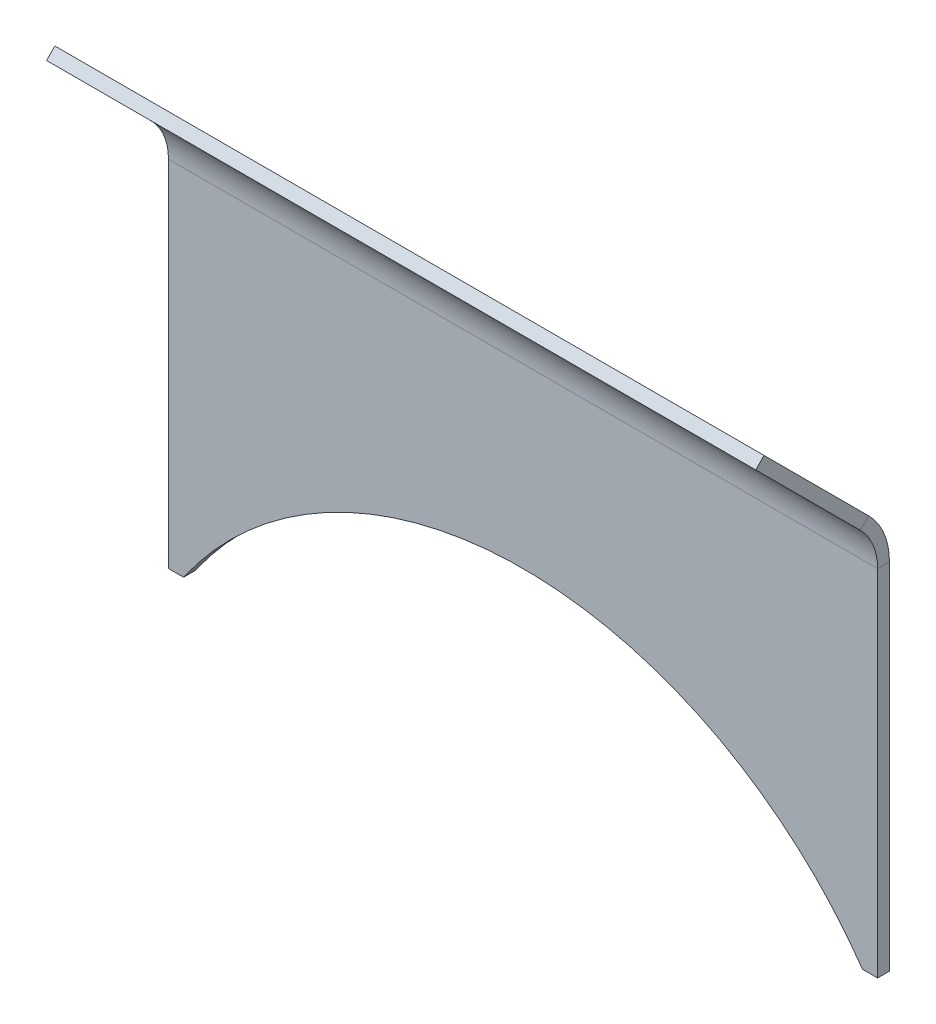
ISO-10303-21;
HEADER;
FILE_DESCRIPTION(('STEP AP214'),'2;1');
FILE_NAME('part.step','',(''),(''),'','','');
FILE_SCHEMA(('AUTOMOTIVE_DESIGN { 1 0 10303 214 1 1 1 1 }'));
ENDSEC;
DATA;
#1=APPLICATION_CONTEXT('core data for automotive mechanical design processes');
#2=APPLICATION_PROTOCOL_DEFINITION('international standard','automotive_design',2000,#1);
#3=PRODUCT_CONTEXT('',#1,'mechanical');
#4=PRODUCT('Part','Part','',(#3));
#5=PRODUCT_RELATED_PRODUCT_CATEGORY('part','',(#4));
#6=PRODUCT_DEFINITION_FORMATION('','',#4);
#7=PRODUCT_DEFINITION_CONTEXT('part definition',#1,'design');
#8=PRODUCT_DEFINITION('design','',#6,#7);
#9=PRODUCT_DEFINITION_SHAPE('','',#8);
#10=(LENGTH_UNIT() NAMED_UNIT(*) SI_UNIT(.MILLI.,.METRE.));
#11=(NAMED_UNIT(*) PLANE_ANGLE_UNIT() SI_UNIT($,.RADIAN.));
#12=(NAMED_UNIT(*) SI_UNIT($,.STERADIAN.) SOLID_ANGLE_UNIT());
#13=UNCERTAINTY_MEASURE_WITH_UNIT(LENGTH_MEASURE(1.E-05),#10,'distance_accuracy_value','');
#14=(GEOMETRIC_REPRESENTATION_CONTEXT(3) GLOBAL_UNCERTAINTY_ASSIGNED_CONTEXT((#13)) GLOBAL_UNIT_ASSIGNED_CONTEXT((#10,
#11,#12)) REPRESENTATION_CONTEXT('',''));
#15=CARTESIAN_POINT('',(0.,0.,0.));
#16=DIRECTION('',(0.,0.,1.));
#17=DIRECTION('',(1.,0.,0.));
#18=AXIS2_PLACEMENT_3D('',#15,#16,#17);
#19=CARTESIAN_POINT('',(0.,0.,2.));
#20=DIRECTION('',(0.,1.,0.));
#21=DIRECTION('',(-1.,0.,0.));
#22=AXIS2_PLACEMENT_3D('',#19,#20,#21);
#23=PLANE('',#22);
#24=DIRECTION('',(0.,0.,-1.));
#25=VECTOR('',#24,1.);
#26=CARTESIAN_POINT('',(117.44562646538,0.,22.6284169979694));
#27=LINE('',#26,#25);
#28=CARTESIAN_POINT('',(117.44562646538,0.,2.));
#29=VERTEX_POINT('',#28);
#30=CARTESIAN_POINT('',(117.44562646538,0.,0.));
#31=VERTEX_POINT('',#30);
#32=EDGE_CURVE('E148',#29,#31,#27,.T.);
#33=ORIENTED_EDGE('',*,*,#32,.T.);
#34=DIRECTION('',(1.,0.,0.));
#35=VECTOR('',#34,1.);
#36=CARTESIAN_POINT('',(0.,0.,0.));
#37=LINE('',#36,#35);
#38=CARTESIAN_POINT('',(120.,0.,0.));
#39=VERTEX_POINT('',#38);
#40=EDGE_CURVE('E158',#31,#39,#37,.T.);
#41=ORIENTED_EDGE('',*,*,#40,.T.);
#42=DIRECTION('',(0.,0.,-1.));
#43=VECTOR('',#42,1.);
#44=CARTESIAN_POINT('',(120.,0.,2.));
#45=LINE('',#44,#43);
#46=CARTESIAN_POINT('',(120.,0.,2.));
#47=VERTEX_POINT('',#46);
#48=EDGE_CURVE('E69',#47,#39,#45,.T.);
#49=ORIENTED_EDGE('',*,*,#48,.F.);
#50=DIRECTION('',(1.,0.,0.));
#51=VECTOR('',#50,1.);
#52=CARTESIAN_POINT('',(0.,0.,2.));
#53=LINE('',#52,#51);
#54=EDGE_CURVE('E159',#29,#47,#53,.T.);
#55=ORIENTED_EDGE('',*,*,#54,.F.);
#56=EDGE_LOOP('',(#33,#41,#49,#55));
#57=FACE_BOUND('',#56,.T.);
#58=ADVANCED_FACE('F61',(#57),#23,.F.);
#59=DIRECTION('',(0.,0.,-1.));
#60=VECTOR('',#59,1.);
#61=CARTESIAN_POINT('',(2.55437353461967,0.,22.6284169979694));
#62=LINE('',#61,#60);
#63=CARTESIAN_POINT('',(2.55437353461966,0.,0.));
#64=VERTEX_POINT('',#63);
#65=CARTESIAN_POINT('',(2.55437353461967,0.,2.));
#66=VERTEX_POINT('',#65);
#67=EDGE_CURVE('E76',#64,#66,#62,.F.);
#68=ORIENTED_EDGE('',*,*,#67,.T.);
#69=CARTESIAN_POINT('',(0.,0.,2.));
#70=VERTEX_POINT('',#69);
#71=EDGE_CURVE('E110',#70,#66,#53,.T.);
#72=ORIENTED_EDGE('',*,*,#71,.F.);
#73=DIRECTION('',(0.,0.,-1.));
#74=VECTOR('',#73,1.);
#75=CARTESIAN_POINT('',(0.,0.,2.));
#76=LINE('',#75,#74);
#77=CARTESIAN_POINT('',(0.,0.,0.));
#78=VERTEX_POINT('',#77);
#79=EDGE_CURVE('E13',#70,#78,#76,.T.);
#80=ORIENTED_EDGE('',*,*,#79,.T.);
#81=EDGE_CURVE('E162',#78,#64,#37,.T.);
#82=ORIENTED_EDGE('',*,*,#81,.T.);
#83=EDGE_LOOP('',(#68,#72,#80,#82));
#84=FACE_BOUND('',#83,.T.);
#85=ADVANCED_FACE('F229',(#84),#23,.F.);
#86=CARTESIAN_POINT('',(0.,0.,2.));
#87=DIRECTION('',(0.,0.,1.));
#88=DIRECTION('',(1.,0.,0.));
#89=AXIS2_PLACEMENT_3D('',#86,#87,#88);
#90=PLANE('',#89);
#91=ORIENTED_EDGE('',*,*,#71,.T.);
#92=CARTESIAN_POINT('',(60.,-40.,2.));
#93=DIRECTION('',(0.,0.,1.));
#94=DIRECTION('',(1.,0.,0.));
#95=AXIS2_PLACEMENT_3D('',#92,#93,#94);
#96=CIRCLE('',#95,70.);
#97=EDGE_CURVE('E153',#29,#66,#96,.T.);
#98=ORIENTED_EDGE('',*,*,#97,.F.);
#99=ORIENTED_EDGE('',*,*,#54,.T.);
#100=DIRECTION('',(0.,1.,0.));
#101=VECTOR('',#100,1.);
#102=CARTESIAN_POINT('',(120.,0.,2.));
#103=LINE('',#102,#101);
#104=CARTESIAN_POINT('',(120.,60.,2.));
#105=VERTEX_POINT('',#104);
#106=EDGE_CURVE('E182',#47,#105,#103,.T.);
#107=ORIENTED_EDGE('',*,*,#106,.T.);
#108=DIRECTION('',(-1.,0.,0.));
#109=VECTOR('',#108,1.);
#110=CARTESIAN_POINT('',(120.,60.,2.));
#111=LINE('',#110,#109);
#112=CARTESIAN_POINT('',(0.,60.,2.));
#113=VERTEX_POINT('',#112);
#114=EDGE_CURVE('E85',#105,#113,#111,.T.);
#115=ORIENTED_EDGE('',*,*,#114,.T.);
#116=DIRECTION('',(0.,-1.,0.));
#117=VECTOR('',#116,1.);
#118=CARTESIAN_POINT('',(0.,60.,2.));
#119=LINE('',#118,#117);
#120=EDGE_CURVE('E174',#113,#70,#119,.T.);
#121=ORIENTED_EDGE('',*,*,#120,.T.);
#122=EDGE_LOOP('',(#91,#98,#99,#107,#115,#121));
#123=FACE_BOUND('',#122,.T.);
#124=ADVANCED_FACE('F230',(#123),#90,.T.);
#125=CARTESIAN_POINT('',(0.,0.,0.));
#126=DIRECTION('',(0.,0.,1.));
#127=DIRECTION('',(1.,0.,0.));
#128=AXIS2_PLACEMENT_3D('',#125,#126,#127);
#129=PLANE('',#128);
#130=CARTESIAN_POINT('',(60.,-40.,0.));
#131=DIRECTION('',(0.,0.,1.));
#132=DIRECTION('',(1.,0.,0.));
#133=AXIS2_PLACEMENT_3D('',#130,#131,#132);
#134=CIRCLE('',#133,70.);
#135=EDGE_CURVE('E145',#31,#64,#134,.T.);
#136=ORIENTED_EDGE('',*,*,#135,.T.);
#137=ORIENTED_EDGE('',*,*,#81,.F.);
#138=DIRECTION('',(0.,-1.,0.));
#139=VECTOR('',#138,1.);
#140=CARTESIAN_POINT('',(0.,60.,0.));
#141=LINE('',#140,#139);
#142=CARTESIAN_POINT('',(0.,60.,0.));
#143=VERTEX_POINT('',#142);
#144=EDGE_CURVE('E163',#143,#78,#141,.T.);
#145=ORIENTED_EDGE('',*,*,#144,.F.);
#146=DIRECTION('',(-1.,0.,0.));
#147=VECTOR('',#146,1.);
#148=CARTESIAN_POINT('',(120.,60.,0.));
#149=LINE('',#148,#147);
#150=CARTESIAN_POINT('',(120.,60.,0.));
#151=VERTEX_POINT('',#150);
#152=EDGE_CURVE('E171',#151,#143,#149,.T.);
#153=ORIENTED_EDGE('',*,*,#152,.F.);
#154=DIRECTION('',(0.,1.,0.));
#155=VECTOR('',#154,1.);
#156=CARTESIAN_POINT('',(120.,0.,0.));
#157=LINE('',#156,#155);
#158=EDGE_CURVE('E104',#39,#151,#157,.T.);
#159=ORIENTED_EDGE('',*,*,#158,.F.);
#160=ORIENTED_EDGE('',*,*,#40,.F.);
#161=EDGE_LOOP('',(#136,#137,#145,#153,#159,#160));
#162=FACE_BOUND('',#161,.T.);
#163=ADVANCED_FACE('F161',(#162),#129,.F.);
#164=CARTESIAN_POINT('',(0.,60.,2.));
#165=DIRECTION('',(1.,0.,0.));
#166=DIRECTION('',(0.,1.,0.));
#167=AXIS2_PLACEMENT_3D('',#164,#165,#166);
#168=PLANE('',#167);
#169=ORIENTED_EDGE('',*,*,#144,.T.);
#170=ORIENTED_EDGE('',*,*,#79,.F.);
#171=ORIENTED_EDGE('',*,*,#120,.F.);
#172=DIRECTION('',(0.,0.,-1.));
#173=VECTOR('',#172,1.);
#174=CARTESIAN_POINT('',(0.,60.,2.));
#175=LINE('',#174,#173);
#176=EDGE_CURVE('E175',#113,#143,#175,.T.);
#177=ORIENTED_EDGE('',*,*,#176,.T.);
#178=EDGE_LOOP('',(#169,#170,#171,#177));
#179=FACE_BOUND('',#178,.T.);
#180=ADVANCED_FACE('F63',(#179),#168,.F.);
#181=CARTESIAN_POINT('',(120.,0.,2.));
#182=DIRECTION('',(-1.,0.,0.));
#183=DIRECTION('',(0.,-1.,0.));
#184=AXIS2_PLACEMENT_3D('',#181,#182,#183);
#185=PLANE('',#184);
#186=ORIENTED_EDGE('',*,*,#158,.T.);
#187=DIRECTION('',(0.,0.,-1.));
#188=VECTOR('',#187,1.);
#189=CARTESIAN_POINT('',(120.,60.,2.));
#190=LINE('',#189,#188);
#191=EDGE_CURVE('E178',#105,#151,#190,.T.);
#192=ORIENTED_EDGE('',*,*,#191,.F.);
#193=ORIENTED_EDGE('',*,*,#106,.F.);
#194=ORIENTED_EDGE('',*,*,#48,.T.);
#195=EDGE_LOOP('',(#186,#192,#193,#194));
#196=FACE_BOUND('',#195,.T.);
#197=ADVANCED_FACE('F181',(#196),#185,.F.);
#198=CARTESIAN_POINT('',(120.,60.,12.));
#199=DIRECTION('',(1.,0.,0.));
#200=DIRECTION('',(0.,0.,-1.));
#201=AXIS2_PLACEMENT_3D('',#198,#199,#200);
#202=PLANE('',#201);
#203=DIRECTION('',(0.,-0.707106781186544,0.707106781186551));
#204=VECTOR('',#203,1.);
#205=CARTESIAN_POINT('',(120.,68.4852813742386,3.5147186257614));
#206=LINE('',#205,#204);
#207=CARTESIAN_POINT('',(120.,67.0710678118655,4.9289321881345));
#208=VERTEX_POINT('',#207);
#209=CARTESIAN_POINT('',(120.,68.4852813742386,3.5147186257614));
#210=VERTEX_POINT('',#209);
#211=EDGE_CURVE('E199',#208,#210,#206,.F.);
#212=ORIENTED_EDGE('',*,*,#211,.F.);
#213=CARTESIAN_POINT('',(120.,60.,12.));
#214=DIRECTION('',(-1.,0.,0.));
#215=DIRECTION('',(0.,0.,1.));
#216=AXIS2_PLACEMENT_3D('',#213,#214,#215);
#217=CIRCLE('',#216,10.);
#218=EDGE_CURVE('E190',#105,#208,#217,.F.);
#219=ORIENTED_EDGE('',*,*,#218,.F.);
#220=ORIENTED_EDGE('',*,*,#191,.T.);
#221=CARTESIAN_POINT('',(120.,60.,12.));
#222=DIRECTION('',(-1.,0.,0.));
#223=DIRECTION('',(0.,0.,1.));
#224=AXIS2_PLACEMENT_3D('',#221,#222,#223);
#225=CIRCLE('',#224,12.);
#226=EDGE_CURVE('E166',#151,#210,#225,.F.);
#227=ORIENTED_EDGE('',*,*,#226,.T.);
#228=EDGE_LOOP('',(#212,#219,#220,#227));
#229=FACE_BOUND('',#228,.T.);
#230=ADVANCED_FACE('F238',(#229),#202,.T.);
#231=CARTESIAN_POINT('',(0.,60.,12.));
#232=DIRECTION('',(1.,0.,0.));
#233=DIRECTION('',(0.,0.,-1.));
#234=AXIS2_PLACEMENT_3D('',#231,#232,#233);
#235=PLANE('',#234);
#236=CARTESIAN_POINT('',(0.,60.,12.));
#237=DIRECTION('',(-1.,0.,0.));
#238=DIRECTION('',(0.,0.,1.));
#239=AXIS2_PLACEMENT_3D('',#236,#237,#238);
#240=CIRCLE('',#239,10.);
#241=CARTESIAN_POINT('',(0.,67.0710678118655,4.92893218813447));
#242=VERTEX_POINT('',#241);
#243=EDGE_CURVE('E187',#242,#113,#240,.T.);
#244=ORIENTED_EDGE('',*,*,#243,.F.);
#245=DIRECTION('',(0.,-0.707106781186544,0.707106781186551));
#246=VECTOR('',#245,1.);
#247=CARTESIAN_POINT('',(0.,67.0710678118654,4.92893218813449));
#248=LINE('',#247,#246);
#249=CARTESIAN_POINT('',(0.,68.4852813742385,3.51471862576139));
#250=VERTEX_POINT('',#249);
#251=EDGE_CURVE('E204',#242,#250,#248,.F.);
#252=ORIENTED_EDGE('',*,*,#251,.T.);
#253=CARTESIAN_POINT('',(0.,60.,12.));
#254=DIRECTION('',(-1.,0.,0.));
#255=DIRECTION('',(0.,0.,1.));
#256=AXIS2_PLACEMENT_3D('',#253,#254,#255);
#257=CIRCLE('',#256,12.);
#258=EDGE_CURVE('E194',#250,#143,#257,.T.);
#259=ORIENTED_EDGE('',*,*,#258,.T.);
#260=ORIENTED_EDGE('',*,*,#176,.F.);
#261=EDGE_LOOP('',(#244,#252,#259,#260));
#262=FACE_BOUND('',#261,.T.);
#263=ADVANCED_FACE('F283',(#262),#235,.F.);
#264=CARTESIAN_POINT('',(0.,60.,12.));
#265=DIRECTION('',(-1.,0.,0.));
#266=DIRECTION('',(0.,0.707106781186544,-0.707106781186551));
#267=AXIS2_PLACEMENT_3D('',#264,#265,#266);
#268=CYLINDRICAL_SURFACE('',#267,12.);
#269=ORIENTED_EDGE('',*,*,#152,.T.);
#270=ORIENTED_EDGE('',*,*,#258,.F.);
#271=DIRECTION('',(-1.,0.,0.));
#272=VECTOR('',#271,1.);
#273=CARTESIAN_POINT('',(120.,68.4852813742386,3.5147186257614));
#274=LINE('',#273,#272);
#275=EDGE_CURVE('E207',#250,#210,#274,.F.);
#276=ORIENTED_EDGE('',*,*,#275,.T.);
#277=ORIENTED_EDGE('',*,*,#226,.F.);
#278=EDGE_LOOP('',(#269,#270,#276,#277));
#279=FACE_BOUND('',#278,.T.);
#280=ADVANCED_FACE('F239',(#279),#268,.T.);
#281=CARTESIAN_POINT('',(0.,60.,12.));
#282=DIRECTION('',(-1.,0.,0.));
#283=DIRECTION('',(0.,0.707106781186544,-0.707106781186551));
#284=AXIS2_PLACEMENT_3D('',#281,#282,#283);
#285=CYLINDRICAL_SURFACE('',#284,10.);
#286=ORIENTED_EDGE('',*,*,#114,.F.);
#287=ORIENTED_EDGE('',*,*,#218,.T.);
#288=DIRECTION('',(-1.,0.,0.));
#289=VECTOR('',#288,1.);
#290=CARTESIAN_POINT('',(120.,67.0710678118655,4.9289321881345));
#291=LINE('',#290,#289);
#292=EDGE_CURVE('E202',#208,#242,#291,.T.);
#293=ORIENTED_EDGE('',*,*,#292,.T.);
#294=ORIENTED_EDGE('',*,*,#243,.T.);
#295=EDGE_LOOP('',(#286,#287,#293,#294));
#296=FACE_BOUND('',#295,.T.);
#297=ADVANCED_FACE('F260',(#296),#285,.F.);
#298=CARTESIAN_POINT('',(120.,65.556349186104,0.585786437626915));
#299=DIRECTION('',(-1.,0.,0.));
#300=DIRECTION('',(0.,0.,1.));
#301=AXIS2_PLACEMENT_3D('',#298,#299,#300);
#302=PLANE('',#301);
#303=ORIENTED_EDGE('',*,*,#211,.T.);
#304=DIRECTION('',(0.,-0.707106781186551,-0.707106781186544));
#305=VECTOR('',#304,1.);
#306=CARTESIAN_POINT('',(120.,34.5563491861037,-30.4142135623731));
#307=LINE('',#306,#305);
#308=CARTESIAN_POINT('',(120.,86.1837661840737,21.2132034355963));
#309=VERTEX_POINT('',#308);
#310=EDGE_CURVE('E216',#309,#210,#307,.T.);
#311=ORIENTED_EDGE('',*,*,#310,.F.);
#312=DIRECTION('',(0.,-0.707106781186544,0.707106781186551));
#313=VECTOR('',#312,1.);
#314=CARTESIAN_POINT('',(120.,86.1837661840737,21.2132034355963));
#315=LINE('',#314,#313);
#316=CARTESIAN_POINT('',(120.,84.7695526217006,22.6274169979694));
#317=VERTEX_POINT('',#316);
#318=EDGE_CURVE('E223',#309,#317,#315,.T.);
#319=ORIENTED_EDGE('',*,*,#318,.T.);
#320=DIRECTION('',(0.,0.707106781186551,0.707106781186544));
#321=VECTOR('',#320,1.);
#322=CARTESIAN_POINT('',(120.,64.142135623731,2.00000000000001));
#323=LINE('',#322,#321);
#324=EDGE_CURVE('E209',#317,#208,#323,.F.);
#325=ORIENTED_EDGE('',*,*,#324,.T.);
#326=EDGE_LOOP('',(#303,#311,#319,#325));
#327=FACE_BOUND('',#326,.T.);
#328=ADVANCED_FACE('F257',(#327),#302,.F.);
#329=CARTESIAN_POINT('',(0.,86.1837661840736,21.2132034355963));
#330=DIRECTION('',(1.,0.,0.));
#331=DIRECTION('',(0.,1.,0.));
#332=AXIS2_PLACEMENT_3D('',#329,#330,#331);
#333=PLANE('',#332);
#334=ORIENTED_EDGE('',*,*,#251,.F.);
#335=DIRECTION('',(0.,-0.707106781186551,-0.707106781186544));
#336=VECTOR('',#335,1.);
#337=CARTESIAN_POINT('',(0.,84.7695526217006,22.6274169979694));
#338=LINE('',#337,#336);
#339=CARTESIAN_POINT('',(0.,84.7695526217006,22.6274169979694));
#340=VERTEX_POINT('',#339);
#341=EDGE_CURVE('E212',#242,#340,#338,.F.);
#342=ORIENTED_EDGE('',*,*,#341,.T.);
#343=DIRECTION('',(0.,-0.707106781186544,0.707106781186551));
#344=VECTOR('',#343,1.);
#345=CARTESIAN_POINT('',(0.,86.1837661840736,21.2132034355963));
#346=LINE('',#345,#344);
#347=CARTESIAN_POINT('',(0.,86.1837661840736,21.2132034355963));
#348=VERTEX_POINT('',#347);
#349=EDGE_CURVE('E191',#348,#340,#346,.T.);
#350=ORIENTED_EDGE('',*,*,#349,.F.);
#351=DIRECTION('',(0.,0.707106781186551,0.707106781186544));
#352=VECTOR('',#351,1.);
#353=CARTESIAN_POINT('',(0.,34.5563491861037,-30.4142135623731));
#354=LINE('',#353,#352);
#355=EDGE_CURVE('E219',#250,#348,#354,.T.);
#356=ORIENTED_EDGE('',*,*,#355,.F.);
#357=EDGE_LOOP('',(#334,#342,#350,#356));
#358=FACE_BOUND('',#357,.T.);
#359=ADVANCED_FACE('F248',(#358),#333,.F.);
#360=CARTESIAN_POINT('',(0.,34.5563491861037,-30.4142135623731));
#361=DIRECTION('',(0.,-0.707106781186544,0.707106781186551));
#362=DIRECTION('',(0.,-0.707106781186551,-0.707106781186544));
#363=AXIS2_PLACEMENT_3D('',#360,#361,#362);
#364=PLANE('',#363);
#365=ORIENTED_EDGE('',*,*,#275,.F.);
#366=ORIENTED_EDGE('',*,*,#355,.T.);
#367=DIRECTION('',(1.,0.,0.));
#368=VECTOR('',#367,1.);
#369=CARTESIAN_POINT('',(0.,86.1837661840736,21.2132034355963));
#370=LINE('',#369,#368);
#371=EDGE_CURVE('E221',#348,#309,#370,.T.);
#372=ORIENTED_EDGE('',*,*,#371,.T.);
#373=ORIENTED_EDGE('',*,*,#310,.T.);
#374=EDGE_LOOP('',(#365,#366,#372,#373));
#375=FACE_BOUND('',#374,.T.);
#376=ADVANCED_FACE('F243',(#375),#364,.F.);
#377=CARTESIAN_POINT('',(0.,33.1421356237306,-29.));
#378=DIRECTION('',(0.,-0.707106781186544,0.707106781186551));
#379=DIRECTION('',(0.,-0.707106781186551,-0.707106781186544));
#380=AXIS2_PLACEMENT_3D('',#377,#378,#379);
#381=PLANE('',#380);
#382=ORIENTED_EDGE('',*,*,#341,.F.);
#383=ORIENTED_EDGE('',*,*,#292,.F.);
#384=ORIENTED_EDGE('',*,*,#324,.F.);
#385=DIRECTION('',(-1.,0.,0.));
#386=VECTOR('',#385,1.);
#387=CARTESIAN_POINT('',(120.,84.7695526217006,22.6274169979694));
#388=LINE('',#387,#386);
#389=EDGE_CURVE('E214',#340,#317,#388,.F.);
#390=ORIENTED_EDGE('',*,*,#389,.F.);
#391=EDGE_LOOP('',(#382,#383,#384,#390));
#392=FACE_BOUND('',#391,.T.);
#393=ADVANCED_FACE('F263',(#392),#381,.T.);
#394=CARTESIAN_POINT('',(120.,86.1837661840737,21.2132034355963));
#395=DIRECTION('',(0.,-0.707106781186551,-0.707106781186544));
#396=DIRECTION('',(0.,0.707106781186544,-0.707106781186551));
#397=AXIS2_PLACEMENT_3D('',#394,#395,#396);
#398=PLANE('',#397);
#399=ORIENTED_EDGE('',*,*,#389,.T.);
#400=ORIENTED_EDGE('',*,*,#318,.F.);
#401=ORIENTED_EDGE('',*,*,#371,.F.);
#402=ORIENTED_EDGE('',*,*,#349,.T.);
#403=EDGE_LOOP('',(#399,#400,#401,#402));
#404=FACE_BOUND('',#403,.T.);
#405=ADVANCED_FACE('F254',(#404),#398,.F.);
#406=CARTESIAN_POINT('',(60.,-40.,22.6284169979694));
#407=DIRECTION('',(0.,0.,-1.));
#408=DIRECTION('',(-1.,0.,0.));
#409=AXIS2_PLACEMENT_3D('',#406,#407,#408);
#410=CYLINDRICAL_SURFACE('',#409,70.);
#411=ORIENTED_EDGE('',*,*,#97,.T.);
#412=ORIENTED_EDGE('',*,*,#67,.F.);
#413=ORIENTED_EDGE('',*,*,#135,.F.);
#414=ORIENTED_EDGE('',*,*,#32,.F.);
#415=EDGE_LOOP('',(#411,#412,#413,#414));
#416=FACE_BOUND('',#415,.T.);
#417=ADVANCED_FACE('F147',(#416),#410,.F.);
#418=CLOSED_SHELL('',(#58,#85,#124,#163,#180,#197,#230,#263,#280,#297,#328,#359,#376,#393,#405,#417));
#419=MANIFOLD_SOLID_BREP('B2',#418);
#420=ADVANCED_BREP_SHAPE_REPRESENTATION('',(#18,#419),#14);
#421=SHAPE_DEFINITION_REPRESENTATION(#9,#420);
ENDSEC;
END-ISO-10303-21;
